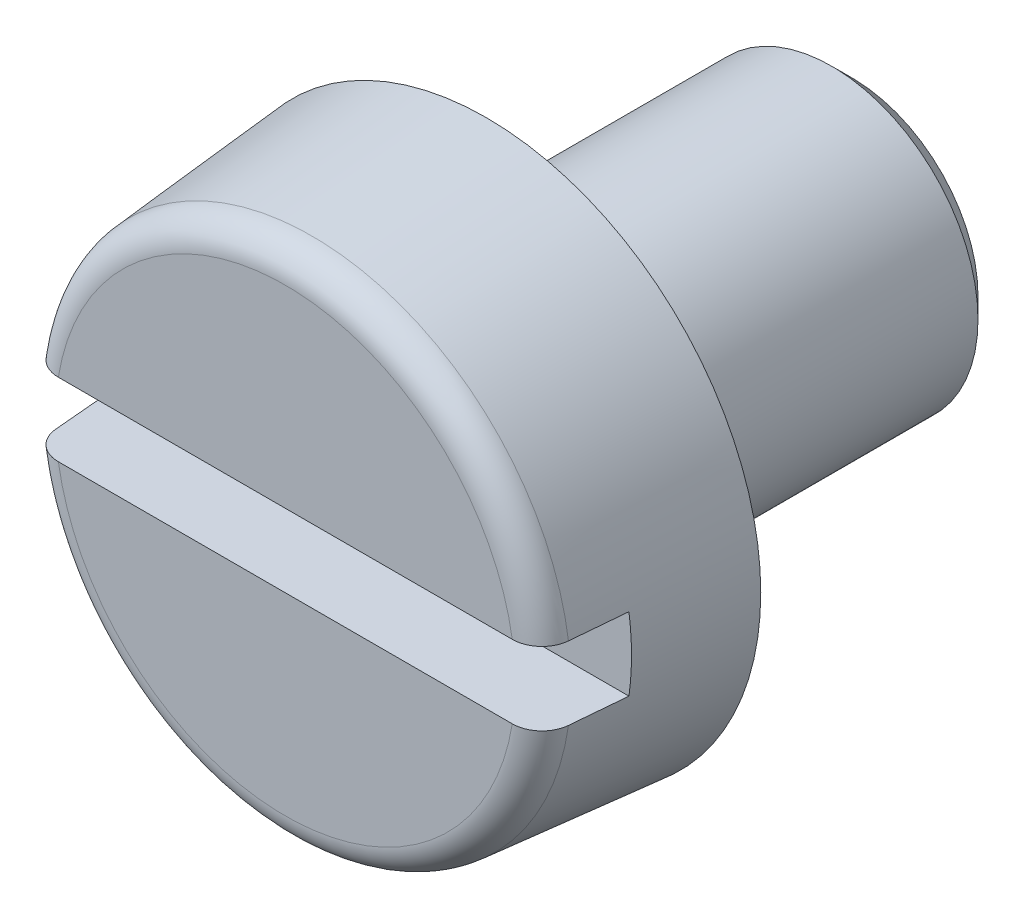
ISO-10303-21;
HEADER;
FILE_DESCRIPTION(('STEP AP214'),'2;1');
FILE_NAME('part.step','',(''),(''),'','','');
FILE_SCHEMA(('AUTOMOTIVE_DESIGN { 1 0 10303 214 1 1 1 1 }'));
ENDSEC;
DATA;
#1=APPLICATION_CONTEXT('core data for automotive mechanical design processes');
#2=APPLICATION_PROTOCOL_DEFINITION('international standard','automotive_design',2000,#1);
#3=PRODUCT_CONTEXT('',#1,'mechanical');
#4=PRODUCT('Part','Part','',(#3));
#5=PRODUCT_RELATED_PRODUCT_CATEGORY('part','',(#4));
#6=PRODUCT_DEFINITION_FORMATION('','',#4);
#7=PRODUCT_DEFINITION_CONTEXT('part definition',#1,'design');
#8=PRODUCT_DEFINITION('design','',#6,#7);
#9=PRODUCT_DEFINITION_SHAPE('','',#8);
#10=(LENGTH_UNIT() NAMED_UNIT(*) SI_UNIT(.MILLI.,.METRE.));
#11=(NAMED_UNIT(*) PLANE_ANGLE_UNIT() SI_UNIT($,.RADIAN.));
#12=(NAMED_UNIT(*) SI_UNIT($,.STERADIAN.) SOLID_ANGLE_UNIT());
#13=UNCERTAINTY_MEASURE_WITH_UNIT(LENGTH_MEASURE(1.E-05),#10,'distance_accuracy_value','');
#14=(GEOMETRIC_REPRESENTATION_CONTEXT(3) GLOBAL_UNCERTAINTY_ASSIGNED_CONTEXT((#13)) GLOBAL_UNIT_ASSIGNED_CONTEXT((#10,
#11,#12)) REPRESENTATION_CONTEXT('',''));
#15=CARTESIAN_POINT('',(0.,0.,0.));
#16=DIRECTION('',(0.,0.,1.));
#17=DIRECTION('',(1.,0.,0.));
#18=AXIS2_PLACEMENT_3D('',#15,#16,#17);
#19=CARTESIAN_POINT('',(0.,0.,0.));
#20=DIRECTION('',(0.,0.,1.));
#21=DIRECTION('',(1.,0.,0.));
#22=AXIS2_PLACEMENT_3D('',#19,#20,#21);
#23=PLANE('',#22);
#24=CARTESIAN_POINT('',(0.,0.,0.));
#25=DIRECTION('',(0.,0.,1.));
#26=DIRECTION('',(1.,0.,0.));
#27=AXIS2_PLACEMENT_3D('',#24,#25,#26);
#28=CIRCLE('',#27,0.9);
#29=CARTESIAN_POINT('',(0.9,0.,0.));
#30=VERTEX_POINT('',#29);
#31=EDGE_CURVE('E191',#30,#30,#28,.T.);
#32=ORIENTED_EDGE('',*,*,#31,.T.);
#33=EDGE_LOOP('',(#32));
#34=FACE_BOUND('',#33,.T.);
#35=CARTESIAN_POINT('',(0.,0.,0.));
#36=DIRECTION('',(0.,0.,1.));
#37=DIRECTION('',(1.,0.,0.));
#38=AXIS2_PLACEMENT_3D('',#35,#36,#37);
#39=CIRCLE('',#38,1.5);
#40=CARTESIAN_POINT('',(1.5,0.,0.));
#41=VERTEX_POINT('',#40);
#42=EDGE_CURVE('E194',#41,#41,#39,.T.);
#43=ORIENTED_EDGE('',*,*,#42,.F.);
#44=EDGE_LOOP('',(#43));
#45=FACE_BOUND('',#44,.T.);
#46=ADVANCED_FACE('F29',(#34,#45),#23,.F.);
#47=CARTESIAN_POINT('',(0.,0.,1.1));
#48=DIRECTION('',(0.,0.,1.));
#49=DIRECTION('',(1.,0.,0.));
#50=AXIS2_PLACEMENT_3D('',#47,#48,#49);
#51=PLANE('',#50);
#52=DIRECTION('',(-1.,0.,0.));
#53=VECTOR('',#52,1.);
#54=CARTESIAN_POINT('',(0.,0.2,1.1));
#55=LINE('',#54,#53);
#56=CARTESIAN_POINT('',(1.24113851797194,0.2,1.1));
#57=VERTEX_POINT('',#56);
#58=CARTESIAN_POINT('',(-1.24113851797194,0.2,1.1));
#59=VERTEX_POINT('',#58);
#60=EDGE_CURVE('E198',#57,#59,#55,.T.);
#61=ORIENTED_EDGE('',*,*,#60,.F.);
#62=CARTESIAN_POINT('',(0.,0.,1.1));
#63=DIRECTION('',(0.,0.,1.));
#64=DIRECTION('',(1.,0.,0.));
#65=AXIS2_PLACEMENT_3D('',#62,#63,#64);
#66=CIRCLE('',#65,1.2571494822787);
#67=EDGE_CURVE('E217',#57,#59,#66,.T.);
#68=ORIENTED_EDGE('',*,*,#67,.T.);
#69=EDGE_LOOP('',(#61,#68));
#70=FACE_BOUND('',#69,.T.);
#71=ADVANCED_FACE('F182',(#70),#51,.T.);
#72=CARTESIAN_POINT('',(0.,0.,0.));
#73=DIRECTION('',(0.,0.,-1.));
#74=DIRECTION('',(1.,0.,0.));
#75=AXIS2_PLACEMENT_3D('',#72,#73,#74);
#76=CONICAL_SURFACE('',#75,1.5,0.0872664625997167);
#77=CARTESIAN_POINT('',(1.63694696402319,-0.2,-1.70444450826545));
#78=CARTESIAN_POINT('',(1.59868622057196,-0.2,-1.27035584370045));
#79=CARTESIAN_POINT('',(1.56040688159087,-0.2,-0.836268817049895));
#80=CARTESIAN_POINT('',(1.48379922367939,-0.2,0.0319009046393231));
#81=CARTESIAN_POINT('',(1.44547090475005,-0.2,0.465983599678079));
#82=CARTESIAN_POINT('',(1.36875349604649,-0.2,1.33414362512093));
#83=CARTESIAN_POINT('',(1.33036440627169,-0.2,1.76822095552497));
#84=CARTESIAN_POINT('',(1.25350594901145,-0.2,2.6363685180719));
#85=CARTESIAN_POINT('',(1.21503658152428,-0.2,3.07043875021463));
#86=CARTESIAN_POINT('',(1.17651732239437,-0.2,3.50450455910632));
#87=B_SPLINE_CURVE_WITH_KNOTS('',3,(#77,#78,#79,#80,#81,#82,#83,#84,#85,#86),.UNSPECIFIED.,.F.,
.F.,(4,2,2,2,4),(0.,1.3073146834816,2.61462933894018,3.92194400689804,5.22925870311256),.UNSPECIFIED.);
#88=CARTESIAN_POINT('',(1.42920643491876,-0.2,0.65));
#89=VERTEX_POINT('',#88);
#90=CARTESIAN_POINT('',(1.4023506578947,-0.2,0.953944918839636));
#91=VERTEX_POINT('',#90);
#92=EDGE_CURVE('E100',#89,#91,#87,.T.);
#93=ORIENTED_EDGE('',*,*,#92,.T.);
#94=CARTESIAN_POINT('',(0.,0.,0.953944918839625));
#95=DIRECTION('',(0.,0.,-1.));
#96=DIRECTION('',(-1.,0.,0.));
#97=AXIS2_PLACEMENT_3D('',#94,#95,#96);
#98=CIRCLE('',#97,1.41654063397338);
#99=CARTESIAN_POINT('',(-1.4023506578947,-0.2,0.953944918839625));
#100=VERTEX_POINT('',#99);
#101=EDGE_CURVE('E95',#91,#100,#98,.T.);
#102=ORIENTED_EDGE('',*,*,#101,.T.);
#103=CARTESIAN_POINT('',(-1.17651732239437,-0.2,3.50450455910632));
#104=CARTESIAN_POINT('',(-1.2412012190237,-0.2,2.77555362864008));
#105=CARTESIAN_POINT('',(-1.30575077646008,-0.2,2.04659080054827));
#106=CARTESIAN_POINT('',(-1.38251002902431,-0.2,1.17843446356217));
#107=CARTESIAN_POINT('',(-1.39481274291971,-0.2,1.03924918086734));
#108=CARTESIAN_POINT('',(-1.48382919022945,-0.2,0.0319035444122988));
#109=CARTESIAN_POINT('',(-1.56041949443346,-0.2,-0.836267720380083));
#110=CARTESIAN_POINT('',(-1.63694696402319,-0.2,-1.70444450826545));
#111=B_SPLINE_CURVE_WITH_KNOTS('',3,(#103,#104,#105,#106,#107,#108,#109,#110),.UNSPECIFIED.,.F.,
.F.,(4,2,2,4),(0.,2.19544551194556,2.61462935834518,5.22925869312412),.UNSPECIFIED.);
#112=CARTESIAN_POINT('',(-1.42920643491876,-0.2,0.65));
#113=VERTEX_POINT('',#112);
#114=EDGE_CURVE('E88',#100,#113,#111,.T.);
#115=ORIENTED_EDGE('',*,*,#114,.T.);
#116=CARTESIAN_POINT('',(0.,0.,0.65));
#117=DIRECTION('',(0.,0.,1.));
#118=DIRECTION('',(1.,0.,0.));
#119=AXIS2_PLACEMENT_3D('',#116,#117,#118);
#120=CIRCLE('',#119,1.44313236870815);
#121=CARTESIAN_POINT('',(-1.42920643491876,0.2,0.65));
#122=VERTEX_POINT('',#121);
#123=EDGE_CURVE('E93',#122,#113,#120,.T.);
#124=ORIENTED_EDGE('',*,*,#123,.F.);
#125=CARTESIAN_POINT('',(-1.63694696402319,0.2,-1.70444450826545));
#126=CARTESIAN_POINT('',(-1.59868622057196,0.2,-1.27035584370045));
#127=CARTESIAN_POINT('',(-1.56040688159087,0.2,-0.836268817049895));
#128=CARTESIAN_POINT('',(-1.48379922367939,0.2,0.0319009046393231));
#129=CARTESIAN_POINT('',(-1.44547090475005,0.2,0.465983599678079));
#130=CARTESIAN_POINT('',(-1.36875349604649,0.2,1.33414362512093));
#131=CARTESIAN_POINT('',(-1.33036440627169,0.2,1.76822095552497));
#132=CARTESIAN_POINT('',(-1.25350594901145,0.2,2.6363685180719));
#133=CARTESIAN_POINT('',(-1.21503658152428,0.2,3.07043875021463));
#134=CARTESIAN_POINT('',(-1.17651732239437,0.2,3.50450455910632));
#135=B_SPLINE_CURVE_WITH_KNOTS('',3,(#125,#126,#127,#128,#129,#130,#131,#132,#133,#134),
.UNSPECIFIED.,.F.,.F.,(4,2,2,2,4),(0.,1.3073146834816,2.61462933894018,3.92194400689804,
5.22925870311256),.UNSPECIFIED.);
#136=CARTESIAN_POINT('',(-1.4023506578947,0.2,0.953944918839636));
#137=VERTEX_POINT('',#136);
#138=EDGE_CURVE('E196',#122,#137,#135,.T.);
#139=ORIENTED_EDGE('',*,*,#138,.T.);
#140=CARTESIAN_POINT('',(0.,0.,0.953944918839625));
#141=DIRECTION('',(0.,0.,-1.));
#142=DIRECTION('',(-1.,0.,0.));
#143=AXIS2_PLACEMENT_3D('',#140,#141,#142);
#144=CIRCLE('',#143,1.41654063397338);
#145=CARTESIAN_POINT('',(1.4023506578947,0.2,0.953944918839625));
#146=VERTEX_POINT('',#145);
#147=EDGE_CURVE('E218',#137,#146,#144,.T.);
#148=ORIENTED_EDGE('',*,*,#147,.T.);
#149=CARTESIAN_POINT('',(1.17651732239437,0.2,3.50450455910632));
#150=CARTESIAN_POINT('',(1.2412012190237,0.2,2.77555362864008));
#151=CARTESIAN_POINT('',(1.30575077646008,0.2,2.04659080054827));
#152=CARTESIAN_POINT('',(1.38251002902431,0.2,1.17843446356217));
#153=CARTESIAN_POINT('',(1.39481274291971,0.2,1.03924918086734));
#154=CARTESIAN_POINT('',(1.48382919022945,0.2,0.0319035444122988));
#155=CARTESIAN_POINT('',(1.56041949443346,0.2,-0.836267720380083));
#156=CARTESIAN_POINT('',(1.63694696402319,0.2,-1.70444450826545));
#157=B_SPLINE_CURVE_WITH_KNOTS('',3,(#149,#150,#151,#152,#153,#154,#155,#156),.UNSPECIFIED.,.F.,
.F.,(4,2,2,4),(0.,2.19544551194556,2.61462935834518,5.22925869312412),.UNSPECIFIED.);
#158=CARTESIAN_POINT('',(1.42920643491876,0.2,0.65));
#159=VERTEX_POINT('',#158);
#160=EDGE_CURVE('E99',#146,#159,#157,.T.);
#161=ORIENTED_EDGE('',*,*,#160,.T.);
#162=EDGE_CURVE('E112',#89,#159,#120,.T.);
#163=ORIENTED_EDGE('',*,*,#162,.F.);
#164=EDGE_LOOP('',(#93,#102,#115,#124,#139,#148,#161,#163));
#165=FACE_BOUND('',#164,.T.);
#166=ORIENTED_EDGE('',*,*,#42,.T.);
#167=EDGE_LOOP('',(#166));
#168=FACE_BOUND('',#167,.T.);
#169=ADVANCED_FACE('F31',(#165,#168),#76,.T.);
#170=DIRECTION('',(1.,0.,0.));
#171=VECTOR('',#170,1.);
#172=CARTESIAN_POINT('',(0.,-0.2,1.1));
#173=LINE('',#172,#171);
#174=CARTESIAN_POINT('',(-1.24113851797194,-0.2,1.1));
#175=VERTEX_POINT('',#174);
#176=CARTESIAN_POINT('',(1.24113851797194,-0.2,1.1));
#177=VERTEX_POINT('',#176);
#178=EDGE_CURVE('E195',#175,#177,#173,.T.);
#179=ORIENTED_EDGE('',*,*,#178,.F.);
#180=CARTESIAN_POINT('',(0.,0.,1.1));
#181=DIRECTION('',(0.,0.,1.));
#182=DIRECTION('',(1.,0.,0.));
#183=AXIS2_PLACEMENT_3D('',#180,#181,#182);
#184=CIRCLE('',#183,1.2571494822787);
#185=EDGE_CURVE('E146',#175,#177,#184,.T.);
#186=ORIENTED_EDGE('',*,*,#185,.T.);
#187=EDGE_LOOP('',(#179,#186));
#188=FACE_BOUND('',#187,.T.);
#189=ADVANCED_FACE('F175',(#188),#51,.T.);
#190=CARTESIAN_POINT('',(-1.5,-0.2,0.65));
#191=DIRECTION('',(0.,0.,1.));
#192=DIRECTION('',(1.,0.,0.));
#193=AXIS2_PLACEMENT_3D('',#190,#191,#192);
#194=PLANE('',#193);
#195=ORIENTED_EDGE('',*,*,#123,.T.);
#196=DIRECTION('',(1.,0.,0.));
#197=VECTOR('',#196,1.);
#198=CARTESIAN_POINT('',(-1.5,-0.2,0.65));
#199=LINE('',#198,#197);
#200=EDGE_CURVE('E107',#113,#89,#199,.T.);
#201=ORIENTED_EDGE('',*,*,#200,.T.);
#202=ORIENTED_EDGE('',*,*,#162,.T.);
#203=DIRECTION('',(-1.,0.,0.));
#204=VECTOR('',#203,1.);
#205=CARTESIAN_POINT('',(-1.5,0.2,0.65));
#206=LINE('',#205,#204);
#207=EDGE_CURVE('E110',#159,#122,#206,.T.);
#208=ORIENTED_EDGE('',*,*,#207,.T.);
#209=EDGE_LOOP('',(#195,#201,#202,#208));
#210=FACE_BOUND('',#209,.T.);
#211=ADVANCED_FACE('F105',(#210),#194,.T.);
#212=CARTESIAN_POINT('',(-1.5,0.2,0.65));
#213=DIRECTION('',(0.,1.,0.));
#214=DIRECTION('',(0.,0.,1.));
#215=AXIS2_PLACEMENT_3D('',#212,#213,#214);
#216=PLANE('',#215);
#217=ORIENTED_EDGE('',*,*,#60,.T.);
#218=CARTESIAN_POINT('',(-1.24113851797194,0.2,1.1));
#219=CARTESIAN_POINT('',(-1.25032370355952,0.2,1.10000738761737));
#220=CARTESIAN_POINT('',(-1.25950764629306,0.2,1.09922948606777));
#221=CARTESIAN_POINT('',(-1.27761449185036,0.2,1.09615367942064));
#222=CARTESIAN_POINT('',(-1.28653747824976,0.2,1.09385626666416));
#223=CARTESIAN_POINT('',(-1.30387596183771,0.2,1.08778991427893));
#224=CARTESIAN_POINT('',(-1.31229111391745,0.2,1.08401998668995));
#225=CARTESIAN_POINT('',(-1.32836019585565,0.2,1.07511302169139));
#226=CARTESIAN_POINT('',(-1.33601440564714,0.2,1.06997648959948));
#227=CARTESIAN_POINT('',(-1.35028885408648,0.2,1.0585163330523));
#228=CARTESIAN_POINT('',(-1.35691586325376,0.2,1.05220114481025));
#229=CARTESIAN_POINT('',(-1.36900410933753,0.2,1.03853398475901));
#230=CARTESIAN_POINT('',(-1.37446488966685,0.2,1.031181608747));
#231=CARTESIAN_POINT('',(-1.3840018820174,0.2,1.01573417460225));
#232=CARTESIAN_POINT('',(-1.38809192640135,0.2,1.00764765215306));
#233=CARTESIAN_POINT('',(-1.3948353175921,0.2,0.99090823542957));
#234=CARTESIAN_POINT('',(-1.39749079328325,0.2,0.982256201876929));
#235=CARTESIAN_POINT('',(-1.40078549999863,0.2,0.967013025631142));
#236=CARTESIAN_POINT('',(-1.40177550252601,0.2,0.960496039476369));
#237=CARTESIAN_POINT('',(-1.4023506578947,0.2,0.953944918839626));
#238=B_SPLINE_CURVE_WITH_KNOTS('',3,(#218,#219,#220,#221,#222,#223,#224,#225,#226,#227,#228,
#229,#230,#231,#232,#233,#234,#235,#236,#237),.UNSPECIFIED.,.F.,.F.,(4,2,2,2,2,2,2,2,2,4),(0.,
0.0275210222701396,0.0550331317429439,0.0825637318199781,0.11008416625605,0.137414693820477,
0.164755901951018,0.19181225615685,0.218828347956784,0.238551504114768),.UNSPECIFIED.);
#239=EDGE_CURVE('E11',#59,#137,#238,.T.);
#240=ORIENTED_EDGE('',*,*,#239,.T.);
#241=ORIENTED_EDGE('',*,*,#138,.F.);
#242=ORIENTED_EDGE('',*,*,#207,.F.);
#243=ORIENTED_EDGE('',*,*,#160,.F.);
#244=CARTESIAN_POINT('',(1.4023506578947,0.2,0.953944918839625));
#245=CARTESIAN_POINT('',(1.4015710715235,0.2,0.962856835930209));
#246=CARTESIAN_POINT('',(1.40002161287459,0.2,0.971697726788971));
#247=CARTESIAN_POINT('',(1.39546602675182,0.2,0.988986399710757));
#248=CARTESIAN_POINT('',(1.392461433283,0.2,0.997434585507832));
#249=CARTESIAN_POINT('',(1.38507532897079,0.2,1.0137095179768));
#250=CARTESIAN_POINT('',(1.38069331757931,0.2,1.02153603744042));
#251=CARTESIAN_POINT('',(1.37068507518658,0.2,1.03634599342474));
#252=CARTESIAN_POINT('',(1.36505902384331,0.2,1.04332955145678));
#253=CARTESIAN_POINT('',(1.35269425914827,0.2,1.05629626077548));
#254=CARTESIAN_POINT('',(1.34595019913103,0.2,1.06227431236281));
#255=CARTESIAN_POINT('',(1.33156047425471,0.2,1.07302906651685));
#256=CARTESIAN_POINT('',(1.32391444797708,0.2,1.07780528509002));
#257=CARTESIAN_POINT('',(1.3078531961095,0.2,1.08607286408102));
#258=CARTESIAN_POINT('',(1.29943062556861,0.2,1.08954995278808));
#259=CARTESIAN_POINT('',(1.28213413284936,0.2,1.09505157055784));
#260=CARTESIAN_POINT('',(1.27326072932335,0.2,1.09707773003126));
#261=CARTESIAN_POINT('',(1.2566181996561,0.2,1.09945333558045));
#262=CARTESIAN_POINT('',(1.24887742772005,0.2,1.10000470766319));
#263=CARTESIAN_POINT('',(1.24113851797195,0.2,1.1));
#264=B_SPLINE_CURVE_WITH_KNOTS('',3,(#244,#245,#246,#247,#248,#249,#250,#251,#252,#253,#254,
#255,#256,#257,#258,#259,#260,#261,#262,#263),.UNSPECIFIED.,.F.,.F.,(4,2,2,2,2,2,2,2,2,4),(0.,
0.0268008099583865,0.0535734277655851,0.0803557859028837,0.107134278790263,0.134044738542229,
0.160966018198917,0.188174907165492,0.215353173291351,0.238555506670044),.UNSPECIFIED.);
#265=EDGE_CURVE('E43',#146,#57,#264,.T.);
#266=ORIENTED_EDGE('',*,*,#265,.T.);
#267=EDGE_LOOP('',(#217,#240,#241,#242,#243,#266));
#268=FACE_BOUND('',#267,.T.);
#269=ADVANCED_FACE('F131',(#268),#216,.F.);
#270=CARTESIAN_POINT('',(-1.5,-0.2,0.65));
#271=DIRECTION('',(0.,-1.,0.));
#272=DIRECTION('',(0.,0.,-1.));
#273=AXIS2_PLACEMENT_3D('',#270,#271,#272);
#274=PLANE('',#273);
#275=ORIENTED_EDGE('',*,*,#178,.T.);
#276=CARTESIAN_POINT('',(1.24113851797194,-0.2,1.1));
#277=CARTESIAN_POINT('',(1.25032370355952,-0.2,1.10000738761737));
#278=CARTESIAN_POINT('',(1.25950764629306,-0.2,1.09922948606777));
#279=CARTESIAN_POINT('',(1.27761449185036,-0.2,1.09615367942064));
#280=CARTESIAN_POINT('',(1.28653747824976,-0.2,1.09385626666416));
#281=CARTESIAN_POINT('',(1.30387596183771,-0.2,1.08778991427893));
#282=CARTESIAN_POINT('',(1.31229111391745,-0.2,1.08401998668995));
#283=CARTESIAN_POINT('',(1.32836019585565,-0.2,1.07511302169139));
#284=CARTESIAN_POINT('',(1.33601440564714,-0.2,1.06997648959948));
#285=CARTESIAN_POINT('',(1.35028885408648,-0.2,1.0585163330523));
#286=CARTESIAN_POINT('',(1.35691586325376,-0.2,1.05220114481025));
#287=CARTESIAN_POINT('',(1.36900410933753,-0.2,1.03853398475901));
#288=CARTESIAN_POINT('',(1.37446488966685,-0.2,1.031181608747));
#289=CARTESIAN_POINT('',(1.3840018820174,-0.2,1.01573417460225));
#290=CARTESIAN_POINT('',(1.38809192640135,-0.2,1.00764765215306));
#291=CARTESIAN_POINT('',(1.3948353175921,-0.2,0.99090823542957));
#292=CARTESIAN_POINT('',(1.39749079328325,-0.2,0.982256201876929));
#293=CARTESIAN_POINT('',(1.40078549999863,-0.2,0.967013025631142));
#294=CARTESIAN_POINT('',(1.40177550252601,-0.2,0.960496039476369));
#295=CARTESIAN_POINT('',(1.4023506578947,-0.2,0.953944918839626));
#296=B_SPLINE_CURVE_WITH_KNOTS('',3,(#276,#277,#278,#279,#280,#281,#282,#283,#284,#285,#286,
#287,#288,#289,#290,#291,#292,#293,#294,#295),.UNSPECIFIED.,.F.,.F.,(4,2,2,2,2,2,2,2,2,4),(0.,
0.0275210222701396,0.0550331317429439,0.0825637318199781,0.11008416625605,0.137414693820477,
0.164755901951018,0.19181225615685,0.218828347956784,0.238551504114768),.UNSPECIFIED.);
#297=EDGE_CURVE('E145',#177,#91,#296,.T.);
#298=ORIENTED_EDGE('',*,*,#297,.T.);
#299=ORIENTED_EDGE('',*,*,#92,.F.);
#300=ORIENTED_EDGE('',*,*,#200,.F.);
#301=ORIENTED_EDGE('',*,*,#114,.F.);
#302=CARTESIAN_POINT('',(-1.4023506578947,-0.2,0.953944918839625));
#303=CARTESIAN_POINT('',(-1.4015710715235,-0.2,0.962856835930209));
#304=CARTESIAN_POINT('',(-1.40002161287459,-0.2,0.971697726788971));
#305=CARTESIAN_POINT('',(-1.39546602675182,-0.2,0.988986399710757));
#306=CARTESIAN_POINT('',(-1.392461433283,-0.2,0.997434585507832));
#307=CARTESIAN_POINT('',(-1.38507532897079,-0.2,1.0137095179768));
#308=CARTESIAN_POINT('',(-1.38069331757931,-0.2,1.02153603744042));
#309=CARTESIAN_POINT('',(-1.37068507518658,-0.2,1.03634599342474));
#310=CARTESIAN_POINT('',(-1.36505902384331,-0.2,1.04332955145678));
#311=CARTESIAN_POINT('',(-1.35269425914827,-0.2,1.05629626077548));
#312=CARTESIAN_POINT('',(-1.34595019913103,-0.2,1.06227431236281));
#313=CARTESIAN_POINT('',(-1.33156047425471,-0.2,1.07302906651685));
#314=CARTESIAN_POINT('',(-1.32391444797708,-0.2,1.07780528509002));
#315=CARTESIAN_POINT('',(-1.3078531961095,-0.2,1.08607286408102));
#316=CARTESIAN_POINT('',(-1.29943062556861,-0.2,1.08954995278808));
#317=CARTESIAN_POINT('',(-1.28213413284936,-0.2,1.09505157055784));
#318=CARTESIAN_POINT('',(-1.27326072932335,-0.2,1.09707773003126));
#319=CARTESIAN_POINT('',(-1.2566181996561,-0.2,1.09945333558045));
#320=CARTESIAN_POINT('',(-1.24887742772005,-0.2,1.10000470766319));
#321=CARTESIAN_POINT('',(-1.24113851797195,-0.2,1.1));
#322=B_SPLINE_CURVE_WITH_KNOTS('',3,(#302,#303,#304,#305,#306,#307,#308,#309,#310,#311,#312,
#313,#314,#315,#316,#317,#318,#319,#320,#321),.UNSPECIFIED.,.F.,.F.,(4,2,2,2,2,2,2,2,2,4),(0.,
0.0268008099583865,0.0535734277655851,0.0803557859028837,0.107134278790263,0.134044738542229,
0.160966018198917,0.188174907165492,0.215353173291351,0.238555506670044),.UNSPECIFIED.);
#323=EDGE_CURVE('E139',#100,#175,#322,.T.);
#324=ORIENTED_EDGE('',*,*,#323,.T.);
#325=EDGE_LOOP('',(#275,#298,#299,#300,#301,#324));
#326=FACE_BOUND('',#325,.T.);
#327=ADVANCED_FACE('F115',(#326),#274,.F.);
#328=CARTESIAN_POINT('',(0.,0.,-2.));
#329=DIRECTION('',(0.,0.,1.));
#330=DIRECTION('',(1.,0.,0.));
#331=AXIS2_PLACEMENT_3D('',#328,#329,#330);
#332=CYLINDRICAL_SURFACE('',#331,0.8);
#333=CARTESIAN_POINT('',(0.,0.,-1.888));
#334=DIRECTION('',(0.,0.,-1.));
#335=DIRECTION('',(-1.,0.,0.));
#336=AXIS2_PLACEMENT_3D('',#333,#334,#335);
#337=CIRCLE('',#336,0.8);
#338=CARTESIAN_POINT('',(0.8,0.,-1.888));
#339=VERTEX_POINT('',#338);
#340=EDGE_CURVE('E211',#339,#339,#337,.F.);
#341=ORIENTED_EDGE('',*,*,#340,.T.);
#342=EDGE_LOOP('',(#341));
#343=FACE_BOUND('',#342,.T.);
#344=CARTESIAN_POINT('',(0.,0.,-0.1));
#345=DIRECTION('',(0.,0.,1.));
#346=DIRECTION('',(1.,0.,0.));
#347=AXIS2_PLACEMENT_3D('',#344,#345,#346);
#348=CIRCLE('',#347,0.8);
#349=CARTESIAN_POINT('',(0.8,0.,-0.1));
#350=VERTEX_POINT('',#349);
#351=EDGE_CURVE('E111',#350,#350,#348,.F.);
#352=ORIENTED_EDGE('',*,*,#351,.T.);
#353=EDGE_LOOP('',(#352));
#354=FACE_BOUND('',#353,.T.);
#355=ADVANCED_FACE('F130',(#343,#354),#332,.T.);
#356=CARTESIAN_POINT('',(0.,0.,-2.));
#357=DIRECTION('',(0.,0.,-1.));
#358=DIRECTION('',(-1.,0.,0.));
#359=AXIS2_PLACEMENT_3D('',#356,#357,#358);
#360=PLANE('',#359);
#361=CARTESIAN_POINT('',(0.,0.,-2.));
#362=DIRECTION('',(0.,0.,-1.));
#363=DIRECTION('',(-1.,0.,0.));
#364=AXIS2_PLACEMENT_3D('',#361,#362,#363);
#365=CIRCLE('',#364,0.688);
#366=CARTESIAN_POINT('',(0.688000000000001,0.,-2.));
#367=VERTEX_POINT('',#366);
#368=EDGE_CURVE('E209',#367,#367,#365,.T.);
#369=ORIENTED_EDGE('',*,*,#368,.T.);
#370=EDGE_LOOP('',(#369));
#371=FACE_BOUND('',#370,.T.);
#372=ADVANCED_FACE('F167',(#371),#360,.T.);
#373=CARTESIAN_POINT('',(0.,0.,-0.1));
#374=DIRECTION('',(0.,0.,1.));
#375=DIRECTION('',(1.,0.,0.));
#376=AXIS2_PLACEMENT_3D('',#373,#374,#375);
#377=TOROIDAL_SURFACE('',#376,0.9,0.1);
#378=ORIENTED_EDGE('',*,*,#31,.F.);
#379=EDGE_LOOP('',(#378));
#380=FACE_BOUND('',#379,.T.);
#381=ORIENTED_EDGE('',*,*,#351,.F.);
#382=EDGE_LOOP('',(#381));
#383=FACE_BOUND('',#382,.T.);
#384=ADVANCED_FACE('F163',(#380,#383),#377,.F.);
#385=CARTESIAN_POINT('',(0.,0.,-2.));
#386=DIRECTION('',(0.,0.,1.));
#387=DIRECTION('',(1.,0.,0.));
#388=AXIS2_PLACEMENT_3D('',#385,#386,#387);
#389=CONICAL_SURFACE('',#388,0.688,0.785398163397447);
#390=CARTESIAN_POINT('',(0.8,0.,-1.888));
#391=CARTESIAN_POINT('',(0.798833333333334,0.,-1.88916666666667));
#392=CARTESIAN_POINT('',(0.797666666666667,0.,-1.89033333333333));
#393=CARTESIAN_POINT('',(0.795333333333334,0.,-1.89266666666667));
#394=CARTESIAN_POINT('',(0.794166666666667,0.,-1.89383333333333));
#395=CARTESIAN_POINT('',(0.791833333333334,0.,-1.89616666666667));
#396=CARTESIAN_POINT('',(0.790666666666667,0.,-1.89733333333333));
#397=CARTESIAN_POINT('',(0.788333333333333,0.,-1.89966666666667));
#398=CARTESIAN_POINT('',(0.787166666666667,0.,-1.90083333333333));
#399=CARTESIAN_POINT('',(0.784833333333334,0.,-1.90316666666667));
#400=CARTESIAN_POINT('',(0.783666666666667,0.,-1.90433333333333));
#401=CARTESIAN_POINT('',(0.781333333333334,0.,-1.90666666666667));
#402=CARTESIAN_POINT('',(0.780166666666667,0.,-1.90783333333333));
#403=CARTESIAN_POINT('',(0.777833333333333,0.,-1.91016666666667));
#404=CARTESIAN_POINT('',(0.776666666666667,0.,-1.91133333333333));
#405=CARTESIAN_POINT('',(0.774333333333334,0.,-1.91366666666667));
#406=CARTESIAN_POINT('',(0.773166666666667,0.,-1.91483333333333));
#407=CARTESIAN_POINT('',(0.770833333333334,0.,-1.91716666666667));
#408=CARTESIAN_POINT('',(0.769666666666667,0.,-1.91833333333333));
#409=CARTESIAN_POINT('',(0.767333333333334,0.,-1.92066666666667));
#410=CARTESIAN_POINT('',(0.766166666666667,0.,-1.92183333333333));
#411=CARTESIAN_POINT('',(0.763833333333334,0.,-1.92416666666667));
#412=CARTESIAN_POINT('',(0.762666666666667,0.,-1.92533333333333));
#413=CARTESIAN_POINT('',(0.760333333333334,0.,-1.92766666666667));
#414=CARTESIAN_POINT('',(0.759166666666667,0.,-1.92883333333333));
#415=CARTESIAN_POINT('',(0.756833333333334,0.,-1.93116666666667));
#416=CARTESIAN_POINT('',(0.755666666666667,0.,-1.93233333333333));
#417=CARTESIAN_POINT('',(0.753333333333334,0.,-1.93466666666667));
#418=CARTESIAN_POINT('',(0.752166666666667,0.,-1.93583333333333));
#419=CARTESIAN_POINT('',(0.749833333333334,0.,-1.93816666666667));
#420=CARTESIAN_POINT('',(0.748666666666667,0.,-1.93933333333333));
#421=CARTESIAN_POINT('',(0.746333333333334,0.,-1.94166666666667));
#422=CARTESIAN_POINT('',(0.745166666666667,0.,-1.94283333333333));
#423=CARTESIAN_POINT('',(0.742833333333334,0.,-1.94516666666667));
#424=CARTESIAN_POINT('',(0.741666666666667,0.,-1.94633333333333));
#425=CARTESIAN_POINT('',(0.739333333333334,0.,-1.94866666666667));
#426=CARTESIAN_POINT('',(0.738166666666667,0.,-1.94983333333333));
#427=CARTESIAN_POINT('',(0.735833333333334,0.,-1.95216666666667));
#428=CARTESIAN_POINT('',(0.734666666666667,0.,-1.95333333333333));
#429=CARTESIAN_POINT('',(0.732333333333334,0.,-1.95566666666667));
#430=CARTESIAN_POINT('',(0.731166666666667,0.,-1.95683333333333));
#431=CARTESIAN_POINT('',(0.728833333333334,0.,-1.95916666666667));
#432=CARTESIAN_POINT('',(0.727666666666667,0.,-1.96033333333333));
#433=CARTESIAN_POINT('',(0.725333333333334,0.,-1.96266666666667));
#434=CARTESIAN_POINT('',(0.724166666666667,0.,-1.96383333333333));
#435=CARTESIAN_POINT('',(0.721833333333334,0.,-1.96616666666667));
#436=CARTESIAN_POINT('',(0.720666666666667,0.,-1.96733333333333));
#437=CARTESIAN_POINT('',(0.718333333333334,0.,-1.96966666666667));
#438=CARTESIAN_POINT('',(0.717166666666667,0.,-1.97083333333333));
#439=CARTESIAN_POINT('',(0.714833333333334,0.,-1.97316666666667));
#440=CARTESIAN_POINT('',(0.713666666666667,0.,-1.97433333333333));
#441=CARTESIAN_POINT('',(0.711333333333334,0.,-1.97666666666667));
#442=CARTESIAN_POINT('',(0.710166666666667,0.,-1.97783333333333));
#443=CARTESIAN_POINT('',(0.707833333333334,0.,-1.98016666666667));
#444=CARTESIAN_POINT('',(0.706666666666667,0.,-1.98133333333333));
#445=CARTESIAN_POINT('',(0.704333333333334,0.,-1.98366666666667));
#446=CARTESIAN_POINT('',(0.703166666666667,0.,-1.98483333333333));
#447=CARTESIAN_POINT('',(0.700833333333334,0.,-1.98716666666667));
#448=CARTESIAN_POINT('',(0.699666666666667,0.,-1.98833333333333));
#449=CARTESIAN_POINT('',(0.697333333333334,0.,-1.99066666666667));
#450=CARTESIAN_POINT('',(0.696166666666667,0.,-1.99183333333333));
#451=CARTESIAN_POINT('',(0.693833333333334,0.,-1.99416666666667));
#452=CARTESIAN_POINT('',(0.692666666666667,0.,-1.99533333333333));
#453=CARTESIAN_POINT('',(0.690333333333334,0.,-1.99766666666667));
#454=CARTESIAN_POINT('',(0.689166666666667,0.,-1.99883333333333));
#455=CARTESIAN_POINT('',(0.688000000000001,0.,-2.));
#456=B_SPLINE_CURVE_WITH_KNOTS('',3,(#390,#391,#392,#393,#394,#395,#396,#397,#398,#399,#400,
#401,#402,#403,#404,#405,#406,#407,#408,#409,#410,#411,#412,#413,#414,#415,#416,#417,#418,#419,
#420,#421,#422,#423,#424,#425,#426,#427,#428,#429,#430,#431,#432,#433,#434,#435,#436,#437,#438,
#439,#440,#441,#442,#443,#444,#445,#446,#447,#448,#449,#450,#451,#452,#453,#454,#455),
.UNSPECIFIED.,.F.,.F.,(4,2,2,2,2,2,2,2,2,2,2,2,2,2,2,2,2,2,2,2,2,2,2,2,2,2,2,2,2,2,2,2,4),(0.,
0.0049497474683058,0.00989949493661168,0.0148492424049176,0.0197989898732234,0.0247487373415292,
0.0296984848098351,0.0346482322781407,0.0395979797464466,0.0445477272147524,0.0494974746830583,
0.0544472221513642,0.05939696961967,0.0643467170879758,0.0692964645562817,0.0742462120245874,
0.0791959594928932,0.0841457069611991,0.0890954544295049,0.0940452018978106,0.0989949493661164,
0.103944696834422,0.108894444302728,0.113844191771034,0.11879393923934,0.123743686707646,
0.128693434175952,0.133643181644257,0.138592929112563,0.143542676580869,0.148492424049175,
0.153442171517481,0.158391918985787),.UNSPECIFIED.);
#457=EDGE_CURVE('BSEAM157',#339,#367,#456,.T.);
#458=ORIENTED_EDGE('',*,*,#340,.F.);
#459=ORIENTED_EDGE('',*,*,#368,.F.);
#460=ORIENTED_EDGE('',*,*,#457,.T.);
#461=ORIENTED_EDGE('',*,*,#457,.F.);
#462=EDGE_LOOP('',(#458,#460,#459,#461));
#463=FACE_BOUND('',#462,.T.);
#464=ADVANCED_FACE('F157',(#463),#389,.T.);
#465=CARTESIAN_POINT('',(0.,0.,0.94));
#466=DIRECTION('',(0.,0.,1.));
#467=DIRECTION('',(1.,0.,0.));
#468=AXIS2_PLACEMENT_3D('',#465,#466,#467);
#469=TOROIDAL_SURFACE('',#468,1.2571494822787,0.16);
#470=ORIENTED_EDGE('',*,*,#323,.F.);
#471=ORIENTED_EDGE('',*,*,#101,.F.);
#472=ORIENTED_EDGE('',*,*,#297,.F.);
#473=ORIENTED_EDGE('',*,*,#185,.F.);
#474=EDGE_LOOP('',(#470,#471,#472,#473));
#475=FACE_BOUND('',#474,.T.);
#476=ADVANCED_FACE('F152',(#475),#469,.T.);
#477=CARTESIAN_POINT('',(0.,0.,0.94));
#478=DIRECTION('',(0.,0.,1.));
#479=DIRECTION('',(1.,0.,0.));
#480=AXIS2_PLACEMENT_3D('',#477,#478,#479);
#481=TOROIDAL_SURFACE('',#480,1.2571494822787,0.16);
#482=ORIENTED_EDGE('',*,*,#265,.F.);
#483=ORIENTED_EDGE('',*,*,#147,.F.);
#484=ORIENTED_EDGE('',*,*,#239,.F.);
#485=ORIENTED_EDGE('',*,*,#67,.F.);
#486=EDGE_LOOP('',(#482,#483,#484,#485));
#487=FACE_BOUND('',#486,.T.);
#488=ADVANCED_FACE('F156',(#487),#481,.T.);
#489=CLOSED_SHELL('',(#46,#71,#169,#189,#211,#269,#327,#355,#372,#384,#464,#476,#488));
#490=MANIFOLD_SOLID_BREP('B2',#489);
#491=ADVANCED_BREP_SHAPE_REPRESENTATION('',(#18,#490),#14);
#492=SHAPE_DEFINITION_REPRESENTATION(#9,#491);
ENDSEC;
END-ISO-10303-21;
